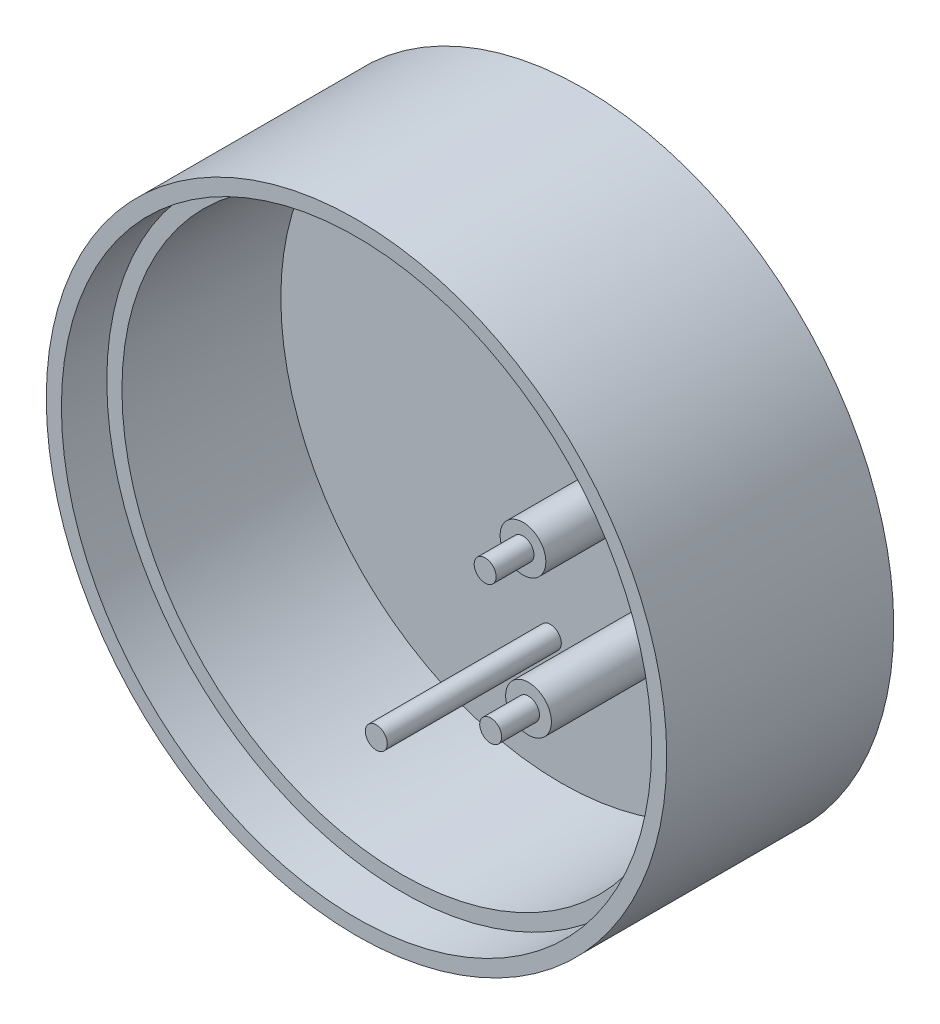
ISO-10303-21;
HEADER;
FILE_DESCRIPTION(('STEP AP214'),'2;1');
FILE_NAME('part.step','',(''),(''),'','','');
FILE_SCHEMA(('AUTOMOTIVE_DESIGN { 1 0 10303 214 1 1 1 1 }'));
ENDSEC;
DATA;
#1=APPLICATION_CONTEXT('core data for automotive mechanical design processes');
#2=APPLICATION_PROTOCOL_DEFINITION('international standard','automotive_design',2000,#1);
#3=PRODUCT_CONTEXT('',#1,'mechanical');
#4=PRODUCT('Part','Part','',(#3));
#5=PRODUCT_RELATED_PRODUCT_CATEGORY('part','',(#4));
#6=PRODUCT_DEFINITION_FORMATION('','',#4);
#7=PRODUCT_DEFINITION_CONTEXT('part definition',#1,'design');
#8=PRODUCT_DEFINITION('design','',#6,#7);
#9=PRODUCT_DEFINITION_SHAPE('','',#8);
#10=(LENGTH_UNIT() NAMED_UNIT(*) SI_UNIT(.MILLI.,.METRE.));
#11=(NAMED_UNIT(*) PLANE_ANGLE_UNIT() SI_UNIT($,.RADIAN.));
#12=(NAMED_UNIT(*) SI_UNIT($,.STERADIAN.) SOLID_ANGLE_UNIT());
#13=UNCERTAINTY_MEASURE_WITH_UNIT(LENGTH_MEASURE(1.E-05),#10,'distance_accuracy_value','');
#14=(GEOMETRIC_REPRESENTATION_CONTEXT(3) GLOBAL_UNCERTAINTY_ASSIGNED_CONTEXT((#13)) GLOBAL_UNIT_ASSIGNED_CONTEXT((#10,
#11,#12)) REPRESENTATION_CONTEXT('',''));
#15=CARTESIAN_POINT('',(0.,0.,0.));
#16=DIRECTION('',(0.,0.,1.));
#17=DIRECTION('',(1.,0.,0.));
#18=AXIS2_PLACEMENT_3D('',#15,#16,#17);
#19=CARTESIAN_POINT('',(0.,0.,30.));
#20=DIRECTION('',(0.,0.,-1.));
#21=DIRECTION('',(-1.,0.,0.));
#22=AXIS2_PLACEMENT_3D('',#19,#20,#21);
#23=CYLINDRICAL_SURFACE('',#22,39.);
#24=CARTESIAN_POINT('',(0.,0.,24.));
#25=DIRECTION('',(0.,0.,1.));
#26=DIRECTION('',(1.,0.,0.));
#27=AXIS2_PLACEMENT_3D('',#24,#25,#26);
#28=CIRCLE('',#27,39.);
#29=CARTESIAN_POINT('',(39.,0.,24.));
#30=VERTEX_POINT('',#29);
#31=EDGE_CURVE('E54',#30,#30,#28,.T.);
#32=ORIENTED_EDGE('',*,*,#31,.F.);
#33=EDGE_LOOP('',(#32));
#34=FACE_BOUND('',#33,.T.);
#35=CARTESIAN_POINT('',(0.,0.,30.));
#36=DIRECTION('',(0.,0.,1.));
#37=DIRECTION('',(1.,0.,0.));
#38=AXIS2_PLACEMENT_3D('',#35,#36,#37);
#39=CIRCLE('',#38,39.);
#40=CARTESIAN_POINT('',(39.,0.,30.));
#41=VERTEX_POINT('',#40);
#42=EDGE_CURVE('E99',#41,#41,#39,.T.);
#43=ORIENTED_EDGE('',*,*,#42,.T.);
#44=EDGE_LOOP('',(#43));
#45=FACE_BOUND('',#44,.T.);
#46=ADVANCED_FACE('F46',(#34,#45),#23,.F.);
#47=CARTESIAN_POINT('',(0.,0.,30.));
#48=DIRECTION('',(0.,0.,-1.));
#49=DIRECTION('',(-1.,0.,0.));
#50=AXIS2_PLACEMENT_3D('',#47,#48,#49);
#51=CYLINDRICAL_SURFACE('',#50,41.);
#52=CARTESIAN_POINT('',(0.,0.,30.));
#53=DIRECTION('',(0.,0.,1.));
#54=DIRECTION('',(1.,0.,0.));
#55=AXIS2_PLACEMENT_3D('',#52,#53,#54);
#56=CIRCLE('',#55,41.);
#57=CARTESIAN_POINT('',(41.,0.,30.));
#58=VERTEX_POINT('',#57);
#59=EDGE_CURVE('E60',#58,#58,#56,.T.);
#60=ORIENTED_EDGE('',*,*,#59,.F.);
#61=EDGE_LOOP('',(#60));
#62=FACE_BOUND('',#61,.T.);
#63=CARTESIAN_POINT('',(0.,0.,0.));
#64=DIRECTION('',(0.,0.,1.));
#65=DIRECTION('',(1.,0.,0.));
#66=AXIS2_PLACEMENT_3D('',#63,#64,#65);
#67=CIRCLE('',#66,41.);
#68=CARTESIAN_POINT('',(41.,0.,0.));
#69=VERTEX_POINT('',#68);
#70=EDGE_CURVE('E98',#69,#69,#67,.T.);
#71=ORIENTED_EDGE('',*,*,#70,.T.);
#72=EDGE_LOOP('',(#71));
#73=FACE_BOUND('',#72,.T.);
#74=ADVANCED_FACE('F109',(#62,#73),#51,.T.);
#75=CARTESIAN_POINT('',(0.,0.,30.));
#76=DIRECTION('',(0.,0.,1.));
#77=DIRECTION('',(1.,0.,0.));
#78=AXIS2_PLACEMENT_3D('',#75,#76,#77);
#79=PLANE('',#78);
#80=ORIENTED_EDGE('',*,*,#42,.F.);
#81=EDGE_LOOP('',(#80));
#82=FACE_BOUND('',#81,.T.);
#83=ORIENTED_EDGE('',*,*,#59,.T.);
#84=EDGE_LOOP('',(#83));
#85=FACE_BOUND('',#84,.T.);
#86=ADVANCED_FACE('F114',(#82,#85),#79,.T.);
#87=CARTESIAN_POINT('',(0.,0.,0.));
#88=DIRECTION('',(0.,0.,1.));
#89=DIRECTION('',(1.,0.,0.));
#90=AXIS2_PLACEMENT_3D('',#87,#88,#89);
#91=PLANE('',#90);
#92=ORIENTED_EDGE('',*,*,#70,.F.);
#93=EDGE_LOOP('',(#92));
#94=FACE_BOUND('',#93,.T.);
#95=ADVANCED_FACE('F111',(#94),#91,.F.);
#96=CARTESIAN_POINT('',(0.,0.,24.));
#97=DIRECTION('',(0.,0.,1.));
#98=DIRECTION('',(1.,0.,0.));
#99=AXIS2_PLACEMENT_3D('',#96,#97,#98);
#100=PLANE('',#99);
#101=ORIENTED_EDGE('',*,*,#31,.T.);
#102=EDGE_LOOP('',(#101));
#103=FACE_BOUND('',#102,.T.);
#104=CARTESIAN_POINT('',(0.,0.,24.));
#105=DIRECTION('',(0.,0.,1.));
#106=DIRECTION('',(1.,0.,0.));
#107=AXIS2_PLACEMENT_3D('',#104,#105,#106);
#108=CIRCLE('',#107,37.);
#109=CARTESIAN_POINT('',(37.,0.,24.));
#110=VERTEX_POINT('',#109);
#111=EDGE_CURVE('E91',#110,#110,#108,.T.);
#112=ORIENTED_EDGE('',*,*,#111,.F.);
#113=EDGE_LOOP('',(#112));
#114=FACE_BOUND('',#113,.T.);
#115=ADVANCED_FACE('F113',(#103,#114),#100,.T.);
#116=CARTESIAN_POINT('',(0.,0.,24.));
#117=DIRECTION('',(0.,0.,-1.));
#118=DIRECTION('',(-1.,0.,0.));
#119=AXIS2_PLACEMENT_3D('',#116,#117,#118);
#120=CYLINDRICAL_SURFACE('',#119,37.);
#121=CARTESIAN_POINT('',(0.,0.,3.));
#122=DIRECTION('',(0.,0.,1.));
#123=DIRECTION('',(1.,0.,0.));
#124=AXIS2_PLACEMENT_3D('',#121,#122,#123);
#125=CIRCLE('',#124,37.);
#126=CARTESIAN_POINT('',(37.,0.,3.));
#127=VERTEX_POINT('',#126);
#128=EDGE_CURVE('E12',#127,#127,#125,.T.);
#129=ORIENTED_EDGE('',*,*,#128,.F.);
#130=EDGE_LOOP('',(#129));
#131=FACE_BOUND('',#130,.T.);
#132=ORIENTED_EDGE('',*,*,#111,.T.);
#133=EDGE_LOOP('',(#132));
#134=FACE_BOUND('',#133,.T.);
#135=ADVANCED_FACE('F120',(#131,#134),#120,.F.);
#136=CARTESIAN_POINT('',(0.,0.,3.));
#137=DIRECTION('',(0.,0.,1.));
#138=DIRECTION('',(1.,0.,0.));
#139=AXIS2_PLACEMENT_3D('',#136,#137,#138);
#140=PLANE('',#139);
#141=CARTESIAN_POINT('',(17.,9.30714148132601,3.));
#142=DIRECTION('',(0.,0.,1.));
#143=DIRECTION('',(1.,0.,0.));
#144=AXIS2_PLACEMENT_3D('',#141,#142,#143);
#145=CIRCLE('',#144,3.02247291172559);
#146=CARTESIAN_POINT('',(20.0224729117256,9.30714148132601,3.));
#147=VERTEX_POINT('',#146);
#148=EDGE_CURVE('E197',#147,#147,#145,.T.);
#149=ORIENTED_EDGE('',*,*,#148,.F.);
#150=EDGE_LOOP('',(#149));
#151=FACE_BOUND('',#150,.T.);
#152=CARTESIAN_POINT('',(15.7327864941309,-10.6526723938218,3.));
#153=DIRECTION('',(0.,0.,1.));
#154=DIRECTION('',(1.,0.,0.));
#155=AXIS2_PLACEMENT_3D('',#152,#153,#154);
#156=CIRCLE('',#155,3.02247291172559);
#157=CARTESIAN_POINT('',(18.7552594058565,-10.6526723938218,3.));
#158=VERTEX_POINT('',#157);
#159=EDGE_CURVE('E76',#158,#158,#156,.T.);
#160=ORIENTED_EDGE('',*,*,#159,.F.);
#161=EDGE_LOOP('',(#160));
#162=FACE_BOUND('',#161,.T.);
#163=CARTESIAN_POINT('',(-1.38249356231057,-21.,3.));
#164=DIRECTION('',(0.,0.,1.));
#165=DIRECTION('',(1.,0.,0.));
#166=AXIS2_PLACEMENT_3D('',#163,#164,#165);
#167=CIRCLE('',#166,1.45);
#168=CARTESIAN_POINT('',(0.0675064376894283,-21.,3.));
#169=VERTEX_POINT('',#168);
#170=EDGE_CURVE('E73',#169,#169,#167,.T.);
#171=ORIENTED_EDGE('',*,*,#170,.F.);
#172=EDGE_LOOP('',(#171));
#173=FACE_BOUND('',#172,.T.);
#174=ORIENTED_EDGE('',*,*,#128,.T.);
#175=EDGE_LOOP('',(#174));
#176=FACE_BOUND('',#175,.T.);
#177=ADVANCED_FACE('F140',(#151,#162,#173,#176),#140,.T.);
#178=CARTESIAN_POINT('',(-1.38249356231057,-21.,26.));
#179=DIRECTION('',(0.,0.,-1.));
#180=DIRECTION('',(-1.,0.,0.));
#181=AXIS2_PLACEMENT_3D('',#178,#179,#180);
#182=CYLINDRICAL_SURFACE('',#181,1.45);
#183=CARTESIAN_POINT('',(-1.38249356231057,-21.,26.));
#184=DIRECTION('',(0.,0.,1.));
#185=DIRECTION('',(1.,0.,0.));
#186=AXIS2_PLACEMENT_3D('',#183,#184,#185);
#187=CIRCLE('',#186,1.45);
#188=CARTESIAN_POINT('',(0.0675064376894283,-21.,26.));
#189=VERTEX_POINT('',#188);
#190=EDGE_CURVE('E87',#189,#189,#187,.T.);
#191=ORIENTED_EDGE('',*,*,#190,.F.);
#192=EDGE_LOOP('',(#191));
#193=FACE_BOUND('',#192,.T.);
#194=ORIENTED_EDGE('',*,*,#170,.T.);
#195=EDGE_LOOP('',(#194));
#196=FACE_BOUND('',#195,.T.);
#197=ADVANCED_FACE('F147',(#193,#196),#182,.T.);
#198=CARTESIAN_POINT('',(-1.38249356231057,-21.,26.));
#199=DIRECTION('',(0.,0.,1.));
#200=DIRECTION('',(1.,0.,0.));
#201=AXIS2_PLACEMENT_3D('',#198,#199,#200);
#202=PLANE('',#201);
#203=ORIENTED_EDGE('',*,*,#190,.T.);
#204=EDGE_LOOP('',(#203));
#205=FACE_BOUND('',#204,.T.);
#206=ADVANCED_FACE('F153',(#205),#202,.T.);
#207=CARTESIAN_POINT('',(15.7327864941309,-10.6526723938218,23.));
#208=DIRECTION('',(0.,0.,-1.));
#209=DIRECTION('',(-1.,0.,0.));
#210=AXIS2_PLACEMENT_3D('',#207,#208,#209);
#211=CYLINDRICAL_SURFACE('',#210,3.02247291172559);
#212=CARTESIAN_POINT('',(15.7327864941309,-10.6526723938218,23.));
#213=DIRECTION('',(0.,0.,1.));
#214=DIRECTION('',(1.,0.,0.));
#215=AXIS2_PLACEMENT_3D('',#212,#213,#214);
#216=CIRCLE('',#215,3.02247291172559);
#217=CARTESIAN_POINT('',(18.7552594058565,-10.6526723938218,23.));
#218=VERTEX_POINT('',#217);
#219=EDGE_CURVE('E67',#218,#218,#216,.T.);
#220=ORIENTED_EDGE('',*,*,#219,.F.);
#221=EDGE_LOOP('',(#220));
#222=FACE_BOUND('',#221,.T.);
#223=ORIENTED_EDGE('',*,*,#159,.T.);
#224=EDGE_LOOP('',(#223));
#225=FACE_BOUND('',#224,.T.);
#226=ADVANCED_FACE('F157',(#222,#225),#211,.T.);
#227=CARTESIAN_POINT('',(15.7327864941309,-10.6526723938218,23.));
#228=DIRECTION('',(0.,0.,1.));
#229=DIRECTION('',(1.,0.,0.));
#230=AXIS2_PLACEMENT_3D('',#227,#228,#229);
#231=PLANE('',#230);
#232=CARTESIAN_POINT('',(15.7327864941309,-10.6526723938218,23.));
#233=DIRECTION('',(0.,0.,1.));
#234=DIRECTION('',(1.,0.,0.));
#235=AXIS2_PLACEMENT_3D('',#232,#233,#234);
#236=CIRCLE('',#235,1.45);
#237=CARTESIAN_POINT('',(17.1827864941309,-10.6526723938218,23.));
#238=VERTEX_POINT('',#237);
#239=EDGE_CURVE('E63',#238,#238,#236,.T.);
#240=ORIENTED_EDGE('',*,*,#239,.F.);
#241=EDGE_LOOP('',(#240));
#242=FACE_BOUND('',#241,.T.);
#243=ORIENTED_EDGE('',*,*,#219,.T.);
#244=EDGE_LOOP('',(#243));
#245=FACE_BOUND('',#244,.T.);
#246=ADVANCED_FACE('F166',(#242,#245),#231,.T.);
#247=CARTESIAN_POINT('',(15.7327864941309,-10.6526723938218,28.));
#248=DIRECTION('',(0.,0.,1.));
#249=DIRECTION('',(1.,0.,0.));
#250=AXIS2_PLACEMENT_3D('',#247,#248,#249);
#251=PLANE('',#250);
#252=CARTESIAN_POINT('',(15.7327864941309,-10.6526723938218,28.));
#253=DIRECTION('',(0.,0.,1.));
#254=DIRECTION('',(1.,0.,0.));
#255=AXIS2_PLACEMENT_3D('',#252,#253,#254);
#256=CIRCLE('',#255,1.45);
#257=CARTESIAN_POINT('',(17.1827864941309,-10.6526723938218,28.));
#258=VERTEX_POINT('',#257);
#259=EDGE_CURVE('E66',#258,#258,#256,.T.);
#260=ORIENTED_EDGE('',*,*,#259,.T.);
#261=EDGE_LOOP('',(#260));
#262=FACE_BOUND('',#261,.T.);
#263=ADVANCED_FACE('F163',(#262),#251,.T.);
#264=CARTESIAN_POINT('',(15.7327864941309,-10.6526723938218,28.));
#265=DIRECTION('',(0.,0.,-1.));
#266=DIRECTION('',(-1.,0.,0.));
#267=AXIS2_PLACEMENT_3D('',#264,#265,#266);
#268=CYLINDRICAL_SURFACE('',#267,1.45);
#269=ORIENTED_EDGE('',*,*,#239,.T.);
#270=EDGE_LOOP('',(#269));
#271=FACE_BOUND('',#270,.T.);
#272=ORIENTED_EDGE('',*,*,#259,.F.);
#273=EDGE_LOOP('',(#272));
#274=FACE_BOUND('',#273,.T.);
#275=ADVANCED_FACE('F159',(#271,#274),#268,.T.);
#276=CARTESIAN_POINT('',(17.,9.30714148132601,25.));
#277=DIRECTION('',(0.,0.,-1.));
#278=DIRECTION('',(-1.,0.,0.));
#279=AXIS2_PLACEMENT_3D('',#276,#277,#278);
#280=CYLINDRICAL_SURFACE('',#279,3.02247291172559);
#281=CARTESIAN_POINT('',(17.,9.30714148132601,25.));
#282=DIRECTION('',(0.,0.,1.));
#283=DIRECTION('',(1.,0.,0.));
#284=AXIS2_PLACEMENT_3D('',#281,#282,#283);
#285=CIRCLE('',#284,3.02247291172559);
#286=CARTESIAN_POINT('',(20.0224729117256,9.30714148132601,25.));
#287=VERTEX_POINT('',#286);
#288=EDGE_CURVE('E195',#287,#287,#285,.T.);
#289=ORIENTED_EDGE('',*,*,#288,.F.);
#290=EDGE_LOOP('',(#289));
#291=FACE_BOUND('',#290,.T.);
#292=ORIENTED_EDGE('',*,*,#148,.T.);
#293=EDGE_LOOP('',(#292));
#294=FACE_BOUND('',#293,.T.);
#295=ADVANCED_FACE('F162',(#291,#294),#280,.T.);
#296=CARTESIAN_POINT('',(17.,9.30714148132601,25.));
#297=DIRECTION('',(0.,0.,1.));
#298=DIRECTION('',(1.,0.,0.));
#299=AXIS2_PLACEMENT_3D('',#296,#297,#298);
#300=PLANE('',#299);
#301=CARTESIAN_POINT('',(17.,9.30714148132601,25.));
#302=DIRECTION('',(0.,0.,1.));
#303=DIRECTION('',(1.,0.,0.));
#304=AXIS2_PLACEMENT_3D('',#301,#302,#303);
#305=CIRCLE('',#304,1.45);
#306=CARTESIAN_POINT('',(18.45,9.30714148132601,25.));
#307=VERTEX_POINT('',#306);
#308=EDGE_CURVE('E49',#307,#307,#305,.T.);
#309=ORIENTED_EDGE('',*,*,#308,.F.);
#310=EDGE_LOOP('',(#309));
#311=FACE_BOUND('',#310,.T.);
#312=ORIENTED_EDGE('',*,*,#288,.T.);
#313=EDGE_LOOP('',(#312));
#314=FACE_BOUND('',#313,.T.);
#315=ADVANCED_FACE('F181',(#311,#314),#300,.T.);
#316=CARTESIAN_POINT('',(17.,9.30714148132601,30.));
#317=DIRECTION('',(0.,0.,1.));
#318=DIRECTION('',(1.,0.,0.));
#319=AXIS2_PLACEMENT_3D('',#316,#317,#318);
#320=PLANE('',#319);
#321=CARTESIAN_POINT('',(17.,9.30714148132601,30.));
#322=DIRECTION('',(0.,0.,1.));
#323=DIRECTION('',(1.,0.,0.));
#324=AXIS2_PLACEMENT_3D('',#321,#322,#323);
#325=CIRCLE('',#324,1.45);
#326=CARTESIAN_POINT('',(18.45,9.30714148132601,30.));
#327=VERTEX_POINT('',#326);
#328=EDGE_CURVE('E82',#327,#327,#325,.T.);
#329=ORIENTED_EDGE('',*,*,#328,.T.);
#330=EDGE_LOOP('',(#329));
#331=FACE_BOUND('',#330,.T.);
#332=ADVANCED_FACE('F177',(#331),#320,.T.);
#333=CARTESIAN_POINT('',(17.,9.30714148132601,30.));
#334=DIRECTION('',(0.,0.,-1.));
#335=DIRECTION('',(-1.,0.,0.));
#336=AXIS2_PLACEMENT_3D('',#333,#334,#335);
#337=CYLINDRICAL_SURFACE('',#336,1.45);
#338=ORIENTED_EDGE('',*,*,#308,.T.);
#339=EDGE_LOOP('',(#338));
#340=FACE_BOUND('',#339,.T.);
#341=ORIENTED_EDGE('',*,*,#328,.F.);
#342=EDGE_LOOP('',(#341));
#343=FACE_BOUND('',#342,.T.);
#344=ADVANCED_FACE('F174',(#340,#343),#337,.T.);
#345=CLOSED_SHELL('',(#46,#74,#86,#95,#115,#135,#177,#197,#206,#226,#246,#263,#275,#295,#315,
#332,#344));
#346=MANIFOLD_SOLID_BREP('B2',#345);
#347=ADVANCED_BREP_SHAPE_REPRESENTATION('',(#18,#346),#14);
#348=SHAPE_DEFINITION_REPRESENTATION(#9,#347);
ENDSEC;
END-ISO-10303-21;
